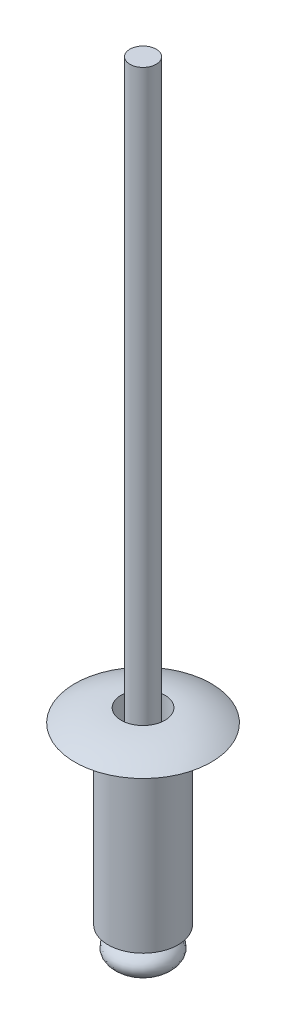
ISO-10303-21;
HEADER;
FILE_DESCRIPTION(('STEP AP214'),'2;1');
FILE_NAME('part.step','',(''),(''),'','','');
FILE_SCHEMA(('AUTOMOTIVE_DESIGN { 1 0 10303 214 1 1 1 1 }'));
ENDSEC;
DATA;
#1=APPLICATION_CONTEXT('core data for automotive mechanical design processes');
#2=APPLICATION_PROTOCOL_DEFINITION('international standard','automotive_design',2000,#1);
#3=PRODUCT_CONTEXT('',#1,'mechanical');
#4=PRODUCT('Part','Part','',(#3));
#5=PRODUCT_RELATED_PRODUCT_CATEGORY('part','',(#4));
#6=PRODUCT_DEFINITION_FORMATION('','',#4);
#7=PRODUCT_DEFINITION_CONTEXT('part definition',#1,'design');
#8=PRODUCT_DEFINITION('design','',#6,#7);
#9=PRODUCT_DEFINITION_SHAPE('','',#8);
#10=(LENGTH_UNIT() NAMED_UNIT(*) SI_UNIT(.MILLI.,.METRE.));
#11=(NAMED_UNIT(*) PLANE_ANGLE_UNIT() SI_UNIT($,.RADIAN.));
#12=(NAMED_UNIT(*) SI_UNIT($,.STERADIAN.) SOLID_ANGLE_UNIT());
#13=UNCERTAINTY_MEASURE_WITH_UNIT(LENGTH_MEASURE(1.E-05),#10,'distance_accuracy_value','');
#14=(GEOMETRIC_REPRESENTATION_CONTEXT(3) GLOBAL_UNCERTAINTY_ASSIGNED_CONTEXT((#13)) GLOBAL_UNIT_ASSIGNED_CONTEXT((#10,
#11,#12)) REPRESENTATION_CONTEXT('',''));
#15=CARTESIAN_POINT('',(0.,0.,0.));
#16=DIRECTION('',(0.,0.,1.));
#17=DIRECTION('',(1.,0.,0.));
#18=AXIS2_PLACEMENT_3D('',#15,#16,#17);
#19=CARTESIAN_POINT('',(0.,5.69333333333334,0.));
#20=DIRECTION('',(0.,-1.,0.));
#21=DIRECTION('',(0.,0.,-1.));
#22=AXIS2_PLACEMENT_3D('',#19,#20,#21);
#23=DEGENERATE_TOROIDAL_SURFACE('',#22,1.25,5.05666666666666,.T.);
#24=CARTESIAN_POINT('',(0.,10.,0.));
#25=DIRECTION('',(0.,-1.,0.));
#26=DIRECTION('',(0.,0.,-1.));
#27=AXIS2_PLACEMENT_3D('',#24,#25,#26);
#28=CIRCLE('',#27,3.9);
#29=CARTESIAN_POINT('',(0.,10.,-3.9));
#30=VERTEX_POINT('',#29);
#31=EDGE_CURVE('E11',#30,#30,#28,.T.);
#32=ORIENTED_EDGE('',*,*,#31,.F.);
#33=EDGE_LOOP('',(#32));
#34=FACE_BOUND('',#33,.T.);
#35=CARTESIAN_POINT('',(0.,10.75,0.));
#36=DIRECTION('',(0.,-1.,0.));
#37=DIRECTION('',(0.,0.,-1.));
#38=AXIS2_PLACEMENT_3D('',#35,#36,#37);
#39=CIRCLE('',#38,1.25);
#40=CARTESIAN_POINT('',(0.,10.75,-1.25));
#41=VERTEX_POINT('',#40);
#42=EDGE_CURVE('E62',#41,#41,#39,.T.);
#43=ORIENTED_EDGE('',*,*,#42,.T.);
#44=EDGE_LOOP('',(#43));
#45=FACE_BOUND('',#44,.T.);
#46=ADVANCED_FACE('F43',(#34,#45),#23,.T.);
#47=CARTESIAN_POINT('',(-2.,10.,0.));
#48=DIRECTION('',(0.,1.,0.));
#49=DIRECTION('',(0.,0.,1.));
#50=AXIS2_PLACEMENT_3D('',#47,#48,#49);
#51=PLANE('',#50);
#52=CARTESIAN_POINT('',(0.,10.,0.));
#53=DIRECTION('',(0.,-1.,0.));
#54=DIRECTION('',(0.,0.,-1.));
#55=AXIS2_PLACEMENT_3D('',#52,#53,#54);
#56=CIRCLE('',#55,2.);
#57=CARTESIAN_POINT('',(0.,10.,-2.));
#58=VERTEX_POINT('',#57);
#59=EDGE_CURVE('E49',#58,#58,#56,.T.);
#60=ORIENTED_EDGE('',*,*,#59,.F.);
#61=EDGE_LOOP('',(#60));
#62=FACE_BOUND('',#61,.T.);
#63=ORIENTED_EDGE('',*,*,#31,.T.);
#64=EDGE_LOOP('',(#63));
#65=FACE_BOUND('',#64,.T.);
#66=ADVANCED_FACE('F81',(#62,#65),#51,.F.);
#67=CARTESIAN_POINT('',(0.,0.,0.));
#68=DIRECTION('',(0.,-1.,0.));
#69=DIRECTION('',(0.,0.,-1.));
#70=AXIS2_PLACEMENT_3D('',#67,#68,#69);
#71=CYLINDRICAL_SURFACE('',#70,2.);
#72=CARTESIAN_POINT('',(0.,0.,0.));
#73=DIRECTION('',(0.,-1.,0.));
#74=DIRECTION('',(0.,0.,-1.));
#75=AXIS2_PLACEMENT_3D('',#72,#73,#74);
#76=CIRCLE('',#75,2.);
#77=CARTESIAN_POINT('',(0.,0.,-2.));
#78=VERTEX_POINT('',#77);
#79=EDGE_CURVE('E53',#78,#78,#76,.T.);
#80=ORIENTED_EDGE('',*,*,#79,.F.);
#81=EDGE_LOOP('',(#80));
#82=FACE_BOUND('',#81,.T.);
#83=ORIENTED_EDGE('',*,*,#59,.T.);
#84=EDGE_LOOP('',(#83));
#85=FACE_BOUND('',#84,.T.);
#86=ADVANCED_FACE('F76',(#82,#85),#71,.T.);
#87=CARTESIAN_POINT('',(-1.25,0.,0.));
#88=DIRECTION('',(0.,1.,0.));
#89=DIRECTION('',(0.,0.,1.));
#90=AXIS2_PLACEMENT_3D('',#87,#88,#89);
#91=PLANE('',#90);
#92=CARTESIAN_POINT('',(0.,0.,0.));
#93=DIRECTION('',(0.,-1.,0.));
#94=DIRECTION('',(0.,0.,-1.));
#95=AXIS2_PLACEMENT_3D('',#92,#93,#94);
#96=CIRCLE('',#95,1.25);
#97=CARTESIAN_POINT('',(0.,0.,-1.25));
#98=VERTEX_POINT('',#97);
#99=EDGE_CURVE('E57',#98,#98,#96,.T.);
#100=ORIENTED_EDGE('',*,*,#99,.F.);
#101=EDGE_LOOP('',(#100));
#102=FACE_BOUND('',#101,.T.);
#103=ORIENTED_EDGE('',*,*,#79,.T.);
#104=EDGE_LOOP('',(#103));
#105=FACE_BOUND('',#104,.T.);
#106=ADVANCED_FACE('F70',(#102,#105),#91,.F.);
#107=CARTESIAN_POINT('',(0.,0.,0.));
#108=DIRECTION('',(0.,-1.,0.));
#109=DIRECTION('',(0.,0.,-1.));
#110=AXIS2_PLACEMENT_3D('',#107,#108,#109);
#111=CYLINDRICAL_SURFACE('',#110,1.25);
#112=ORIENTED_EDGE('',*,*,#42,.F.);
#113=EDGE_LOOP('',(#112));
#114=FACE_BOUND('',#113,.T.);
#115=ORIENTED_EDGE('',*,*,#99,.T.);
#116=EDGE_LOOP('',(#115));
#117=FACE_BOUND('',#116,.T.);
#118=ADVANCED_FACE('F67',(#114,#117),#111,.F.);
#119=CLOSED_SHELL('',(#46,#66,#86,#106,#118));
#120=MANIFOLD_SOLID_BREP('B2',#119);
#121=CARTESIAN_POINT('',(-0.75,43.,0.));
#122=DIRECTION('',(0.,-1.,0.));
#123=DIRECTION('',(0.,0.,-1.));
#124=AXIS2_PLACEMENT_3D('',#121,#122,#123);
#125=PLANE('',#124);
#126=CARTESIAN_POINT('',(0.,43.,0.));
#127=DIRECTION('',(0.,-1.,0.));
#128=DIRECTION('',(0.,0.,-1.));
#129=AXIS2_PLACEMENT_3D('',#126,#127,#128);
#130=CIRCLE('',#129,0.75);
#131=CARTESIAN_POINT('',(0.,43.,-0.75));
#132=VERTEX_POINT('',#131);
#133=EDGE_CURVE('E41',#132,#132,#130,.T.);
#134=ORIENTED_EDGE('',*,*,#133,.F.);
#135=EDGE_LOOP('',(#134));
#136=FACE_BOUND('',#135,.T.);
#137=ADVANCED_FACE('F120',(#136),#125,.F.);
#138=CARTESIAN_POINT('',(0.,0.,0.));
#139=DIRECTION('',(0.,-1.,0.));
#140=DIRECTION('',(0.,0.,-1.));
#141=AXIS2_PLACEMENT_3D('',#138,#139,#140);
#142=CYLINDRICAL_SURFACE('',#141,0.75);
#143=CARTESIAN_POINT('',(0.,1.,0.));
#144=DIRECTION('',(0.,-1.,0.));
#145=DIRECTION('',(0.,0.,-1.));
#146=AXIS2_PLACEMENT_3D('',#143,#144,#145);
#147=CIRCLE('',#146,0.75);
#148=CARTESIAN_POINT('',(0.,1.,-0.75));
#149=VERTEX_POINT('',#148);
#150=EDGE_CURVE('E126',#149,#149,#147,.T.);
#151=ORIENTED_EDGE('',*,*,#150,.F.);
#152=EDGE_LOOP('',(#151));
#153=FACE_BOUND('',#152,.T.);
#154=ORIENTED_EDGE('',*,*,#133,.T.);
#155=EDGE_LOOP('',(#154));
#156=FACE_BOUND('',#155,.T.);
#157=ADVANCED_FACE('F149',(#153,#156),#142,.T.);
#158=CARTESIAN_POINT('',(-1.24,1.,0.));
#159=DIRECTION('',(0.,-1.,0.));
#160=DIRECTION('',(0.,0.,-1.));
#161=AXIS2_PLACEMENT_3D('',#158,#159,#160);
#162=PLANE('',#161);
#163=CARTESIAN_POINT('',(0.,1.,0.));
#164=DIRECTION('',(0.,-1.,0.));
#165=DIRECTION('',(0.,0.,-1.));
#166=AXIS2_PLACEMENT_3D('',#163,#164,#165);
#167=CIRCLE('',#166,1.24);
#168=CARTESIAN_POINT('',(0.,1.,-1.24));
#169=VERTEX_POINT('',#168);
#170=EDGE_CURVE('E138',#169,#169,#167,.T.);
#171=ORIENTED_EDGE('',*,*,#170,.F.);
#172=EDGE_LOOP('',(#171));
#173=FACE_BOUND('',#172,.T.);
#174=ORIENTED_EDGE('',*,*,#150,.T.);
#175=EDGE_LOOP('',(#174));
#176=FACE_BOUND('',#175,.T.);
#177=ADVANCED_FACE('F147',(#173,#176),#162,.F.);
#178=CARTESIAN_POINT('',(0.,0.,0.));
#179=DIRECTION('',(0.,-1.,0.));
#180=DIRECTION('',(0.,0.,-1.));
#181=AXIS2_PLACEMENT_3D('',#178,#179,#180);
#182=CYLINDRICAL_SURFACE('',#181,1.24);
#183=CARTESIAN_POINT('',(0.,-0.5,0.));
#184=DIRECTION('',(0.,-1.,0.));
#185=DIRECTION('',(0.,0.,-1.));
#186=AXIS2_PLACEMENT_3D('',#183,#184,#185);
#187=CIRCLE('',#186,1.24);
#188=CARTESIAN_POINT('',(0.,-0.5,-1.24));
#189=VERTEX_POINT('',#188);
#190=EDGE_CURVE('E136',#189,#189,#187,.T.);
#191=ORIENTED_EDGE('',*,*,#190,.F.);
#192=EDGE_LOOP('',(#191));
#193=FACE_BOUND('',#192,.T.);
#194=ORIENTED_EDGE('',*,*,#170,.T.);
#195=EDGE_LOOP('',(#194));
#196=FACE_BOUND('',#195,.T.);
#197=ADVANCED_FACE('F132',(#193,#196),#182,.T.);
#198=CARTESIAN_POINT('',(0.,-1.12056424743869,0.));
#199=DIRECTION('',(0.,0.,1.));
#200=DIRECTION('',(-1.,0.,0.));
#201=AXIS2_PLACEMENT_3D('',#198,#199,#200);
#202=ELLIPSE('',#201,1.75,0.879435752561307);
#203=TRIMMED_CURVE('',#202,(PARAMETER_VALUE(4.71238898038469)),
(PARAMETER_VALUE(7.85398163397448)),.T.,.PARAMETER.);
#204=CARTESIAN_POINT('',(0.,0.,0.));
#205=DIRECTION('',(0.,-1.,0.));
#206=AXIS1_PLACEMENT('',#204,#205);
#207=SURFACE_OF_REVOLUTION('',#203,#206);
#208=CARTESIAN_POINT('',(0.,-2.,0.));
#209=VERTEX_POINT('',#208);
#210=VERTEX_LOOP('',#209);
#211=FACE_BOUND('',#210,.T.);
#212=ORIENTED_EDGE('',*,*,#190,.T.);
#213=EDGE_LOOP('',(#212));
#214=FACE_BOUND('',#213,.T.);
#215=ADVANCED_FACE('F129',(#211,#214),#207,.T.);
#216=CLOSED_SHELL('',(#137,#157,#177,#197,#215));
#217=MANIFOLD_SOLID_BREP('B6',#216);
#218=ADVANCED_BREP_SHAPE_REPRESENTATION('',(#18,#120,#217),#14);
#219=SHAPE_DEFINITION_REPRESENTATION(#9,#218);
ENDSEC;
END-ISO-10303-21;
